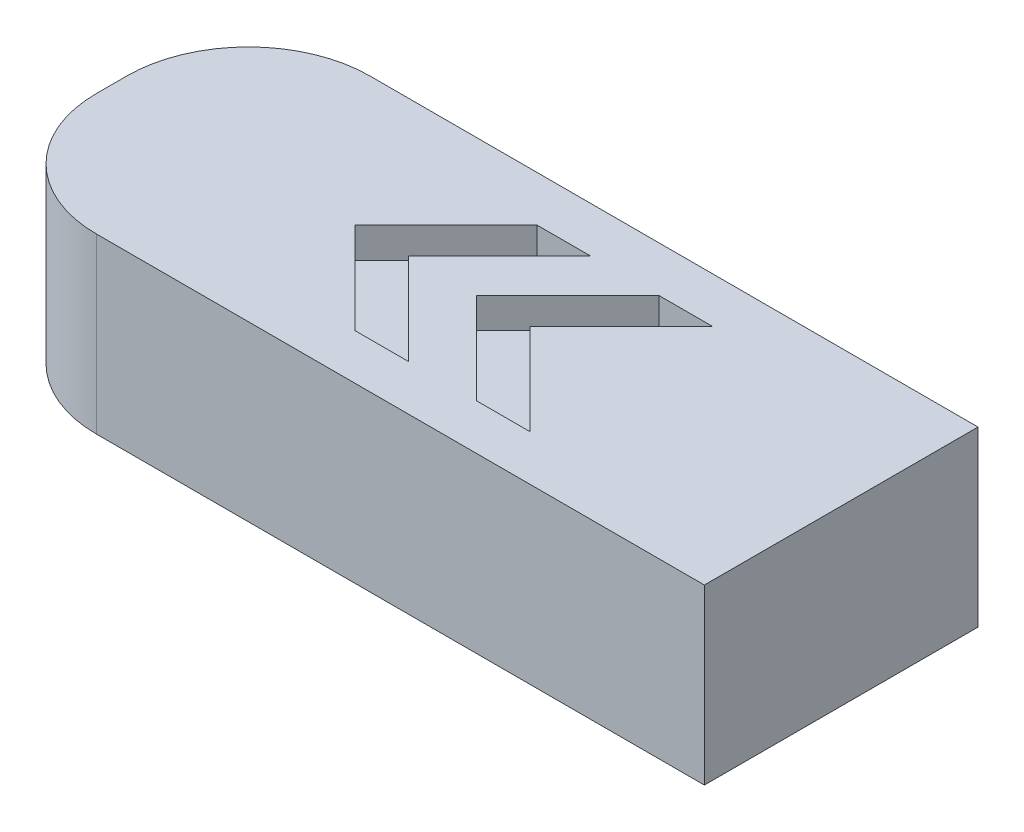
ISO-10303-21;
HEADER;
FILE_DESCRIPTION(('STEP AP214'),'2;1');
FILE_NAME('part.step','',(''),(''),'','','');
FILE_SCHEMA(('AUTOMOTIVE_DESIGN { 1 0 10303 214 1 1 1 1 }'));
ENDSEC;
DATA;
#1=APPLICATION_CONTEXT('core data for automotive mechanical design processes');
#2=APPLICATION_PROTOCOL_DEFINITION('international standard','automotive_design',2000,#1);
#3=PRODUCT_CONTEXT('',#1,'mechanical');
#4=PRODUCT('Part','Part','',(#3));
#5=PRODUCT_RELATED_PRODUCT_CATEGORY('part','',(#4));
#6=PRODUCT_DEFINITION_FORMATION('','',#4);
#7=PRODUCT_DEFINITION_CONTEXT('part definition',#1,'design');
#8=PRODUCT_DEFINITION('design','',#6,#7);
#9=PRODUCT_DEFINITION_SHAPE('','',#8);
#10=(LENGTH_UNIT() NAMED_UNIT(*) SI_UNIT(.MILLI.,.METRE.));
#11=(NAMED_UNIT(*) PLANE_ANGLE_UNIT() SI_UNIT($,.RADIAN.));
#12=(NAMED_UNIT(*) SI_UNIT($,.STERADIAN.) SOLID_ANGLE_UNIT());
#13=UNCERTAINTY_MEASURE_WITH_UNIT(LENGTH_MEASURE(1.E-05),#10,'distance_accuracy_value','');
#14=(GEOMETRIC_REPRESENTATION_CONTEXT(3) GLOBAL_UNCERTAINTY_ASSIGNED_CONTEXT((#13)) GLOBAL_UNIT_ASSIGNED_CONTEXT((#10,
#11,#12)) REPRESENTATION_CONTEXT('',''));
#15=CARTESIAN_POINT('',(0.,0.,0.));
#16=DIRECTION('',(0.,0.,1.));
#17=DIRECTION('',(1.,0.,0.));
#18=AXIS2_PLACEMENT_3D('',#15,#16,#17);
#19=CARTESIAN_POINT('',(0.,5.7,0.));
#20=DIRECTION('',(1.,0.,0.));
#21=DIRECTION('',(0.,0.,-1.));
#22=AXIS2_PLACEMENT_3D('',#19,#20,#21);
#23=PLANE('',#22);
#24=DIRECTION('',(0.,0.,1.));
#25=VECTOR('',#24,1.);
#26=CARTESIAN_POINT('',(0.,5.7,0.));
#27=LINE('',#26,#25);
#28=CARTESIAN_POINT('',(0.,5.7,-5.));
#29=VERTEX_POINT('',#28);
#30=CARTESIAN_POINT('',(0.,5.7,-4.));
#31=VERTEX_POINT('',#30);
#32=EDGE_CURVE('E257',#29,#31,#27,.T.);
#33=ORIENTED_EDGE('',*,*,#32,.F.);
#34=DIRECTION('',(0.,-1.,0.));
#35=VECTOR('',#34,1.);
#36=CARTESIAN_POINT('',(0.,5.7,-5.));
#37=LINE('',#36,#35);
#38=CARTESIAN_POINT('',(0.,0.,-5.));
#39=VERTEX_POINT('',#38);
#40=EDGE_CURVE('E291',#29,#39,#37,.T.);
#41=ORIENTED_EDGE('',*,*,#40,.T.);
#42=DIRECTION('',(0.,0.,1.));
#43=VECTOR('',#42,1.);
#44=CARTESIAN_POINT('',(0.,0.,0.));
#45=LINE('',#44,#43);
#46=CARTESIAN_POINT('',(0.,0.,-4.));
#47=VERTEX_POINT('',#46);
#48=EDGE_CURVE('E247',#39,#47,#45,.T.);
#49=ORIENTED_EDGE('',*,*,#48,.T.);
#50=DIRECTION('',(0.,-1.,0.));
#51=VECTOR('',#50,1.);
#52=CARTESIAN_POINT('',(0.,5.7,-4.));
#53=LINE('',#52,#51);
#54=EDGE_CURVE('E286',#47,#31,#53,.F.);
#55=ORIENTED_EDGE('',*,*,#54,.T.);
#56=EDGE_LOOP('',(#33,#41,#49,#55));
#57=FACE_BOUND('',#56,.T.);
#58=ADVANCED_FACE('F32',(#57),#23,.F.);
#59=CARTESIAN_POINT('',(0.,5.7,0.));
#60=DIRECTION('',(0.,0.,-1.));
#61=DIRECTION('',(-1.,0.,0.));
#62=AXIS2_PLACEMENT_3D('',#59,#60,#61);
#63=PLANE('',#62);
#64=DIRECTION('',(1.,0.,0.));
#65=VECTOR('',#64,1.);
#66=CARTESIAN_POINT('',(0.,5.7,0.));
#67=LINE('',#66,#65);
#68=CARTESIAN_POINT('',(4.,5.7,0.));
#69=VERTEX_POINT('',#68);
#70=CARTESIAN_POINT('',(24.,5.7,0.));
#71=VERTEX_POINT('',#70);
#72=EDGE_CURVE('E259',#69,#71,#67,.T.);
#73=ORIENTED_EDGE('',*,*,#72,.F.);
#74=DIRECTION('',(0.,-1.,0.));
#75=VECTOR('',#74,1.);
#76=CARTESIAN_POINT('',(4.,5.7,0.));
#77=LINE('',#76,#75);
#78=CARTESIAN_POINT('',(4.,0.,0.));
#79=VERTEX_POINT('',#78);
#80=EDGE_CURVE('E280',#69,#79,#77,.T.);
#81=ORIENTED_EDGE('',*,*,#80,.T.);
#82=DIRECTION('',(1.,0.,0.));
#83=VECTOR('',#82,1.);
#84=CARTESIAN_POINT('',(0.,0.,0.));
#85=LINE('',#84,#83);
#86=CARTESIAN_POINT('',(24.,0.,0.));
#87=VERTEX_POINT('',#86);
#88=EDGE_CURVE('E269',#79,#87,#85,.T.);
#89=ORIENTED_EDGE('',*,*,#88,.T.);
#90=DIRECTION('',(0.,-1.,0.));
#91=VECTOR('',#90,1.);
#92=CARTESIAN_POINT('',(24.,5.7,0.));
#93=LINE('',#92,#91);
#94=EDGE_CURVE('E277',#71,#87,#93,.T.);
#95=ORIENTED_EDGE('',*,*,#94,.F.);
#96=EDGE_LOOP('',(#73,#81,#89,#95));
#97=FACE_BOUND('',#96,.T.);
#98=ADVANCED_FACE('F322',(#97),#63,.F.);
#99=CARTESIAN_POINT('',(24.,5.7,0.));
#100=DIRECTION('',(-1.,0.,0.));
#101=DIRECTION('',(0.,0.,1.));
#102=AXIS2_PLACEMENT_3D('',#99,#100,#101);
#103=PLANE('',#102);
#104=DIRECTION('',(0.,0.,-1.));
#105=VECTOR('',#104,1.);
#106=CARTESIAN_POINT('',(24.,0.,0.));
#107=LINE('',#106,#105);
#108=CARTESIAN_POINT('',(24.,0.,-9.));
#109=VERTEX_POINT('',#108);
#110=EDGE_CURVE('E271',#87,#109,#107,.T.);
#111=ORIENTED_EDGE('',*,*,#110,.T.);
#112=DIRECTION('',(0.,-1.,0.));
#113=VECTOR('',#112,1.);
#114=CARTESIAN_POINT('',(24.,5.7,-9.));
#115=LINE('',#114,#113);
#116=CARTESIAN_POINT('',(24.,5.7,-9.));
#117=VERTEX_POINT('',#116);
#118=EDGE_CURVE('E267',#117,#109,#115,.T.);
#119=ORIENTED_EDGE('',*,*,#118,.F.);
#120=DIRECTION('',(0.,0.,-1.));
#121=VECTOR('',#120,1.);
#122=CARTESIAN_POINT('',(24.,5.7,0.));
#123=LINE('',#122,#121);
#124=EDGE_CURVE('E262',#71,#117,#123,.T.);
#125=ORIENTED_EDGE('',*,*,#124,.F.);
#126=ORIENTED_EDGE('',*,*,#94,.T.);
#127=EDGE_LOOP('',(#111,#119,#125,#126));
#128=FACE_BOUND('',#127,.T.);
#129=ADVANCED_FACE('F324',(#128),#103,.F.);
#130=CARTESIAN_POINT('',(0.,5.7,-9.));
#131=DIRECTION('',(0.,0.,1.));
#132=DIRECTION('',(1.,0.,0.));
#133=AXIS2_PLACEMENT_3D('',#130,#131,#132);
#134=PLANE('',#133);
#135=DIRECTION('',(-1.,0.,0.));
#136=VECTOR('',#135,1.);
#137=CARTESIAN_POINT('',(0.,0.,-9.));
#138=LINE('',#137,#136);
#139=CARTESIAN_POINT('',(4.,0.,-9.));
#140=VERTEX_POINT('',#139);
#141=EDGE_CURVE('E260',#109,#140,#138,.T.);
#142=ORIENTED_EDGE('',*,*,#141,.T.);
#143=DIRECTION('',(0.,-1.,0.));
#144=VECTOR('',#143,1.);
#145=CARTESIAN_POINT('',(4.,5.7,-9.));
#146=LINE('',#145,#144);
#147=CARTESIAN_POINT('',(4.,5.7,-9.));
#148=VERTEX_POINT('',#147);
#149=EDGE_CURVE('E40',#140,#148,#146,.F.);
#150=ORIENTED_EDGE('',*,*,#149,.T.);
#151=DIRECTION('',(-1.,0.,0.));
#152=VECTOR('',#151,1.);
#153=CARTESIAN_POINT('',(0.,5.7,-9.));
#154=LINE('',#153,#152);
#155=EDGE_CURVE('E264',#117,#148,#154,.T.);
#156=ORIENTED_EDGE('',*,*,#155,.F.);
#157=ORIENTED_EDGE('',*,*,#118,.T.);
#158=EDGE_LOOP('',(#142,#150,#156,#157));
#159=FACE_BOUND('',#158,.T.);
#160=ADVANCED_FACE('F298',(#159),#134,.F.);
#161=CARTESIAN_POINT('',(0.,5.7,0.));
#162=DIRECTION('',(0.,-1.,0.));
#163=DIRECTION('',(0.,0.,-1.));
#164=AXIS2_PLACEMENT_3D('',#161,#162,#163);
#165=PLANE('',#164);
#166=DIRECTION('',(0.707106781186548,0.,-0.707106781186547));
#167=VECTOR('',#166,1.);
#168=CARTESIAN_POINT('',(16.7677669529664,5.7,-7.5));
#169=LINE('',#168,#167);
#170=CARTESIAN_POINT('',(13.7677669529664,5.7,-4.5));
#171=VERTEX_POINT('',#170);
#172=CARTESIAN_POINT('',(16.7677669529664,5.7,-7.5));
#173=VERTEX_POINT('',#172);
#174=EDGE_CURVE('E191',#171,#173,#169,.T.);
#175=ORIENTED_EDGE('',*,*,#174,.F.);
#176=DIRECTION('',(-0.707106781186548,0.,-0.707106781186547));
#177=VECTOR('',#176,1.);
#178=CARTESIAN_POINT('',(13.7677669529664,5.7,-4.5));
#179=LINE('',#178,#177);
#180=CARTESIAN_POINT('',(16.7677669529664,5.7,-1.5));
#181=VERTEX_POINT('',#180);
#182=EDGE_CURVE('E47',#181,#171,#179,.T.);
#183=ORIENTED_EDGE('',*,*,#182,.F.);
#184=DIRECTION('',(1.,0.,0.));
#185=VECTOR('',#184,1.);
#186=CARTESIAN_POINT('',(16.7677669529664,5.7,-1.5));
#187=LINE('',#186,#185);
#188=CARTESIAN_POINT('',(15.,5.7,-1.5));
#189=VERTEX_POINT('',#188);
#190=EDGE_CURVE('E177',#189,#181,#187,.T.);
#191=ORIENTED_EDGE('',*,*,#190,.F.);
#192=DIRECTION('',(0.707106781186548,0.,0.707106781186547));
#193=VECTOR('',#192,1.);
#194=CARTESIAN_POINT('',(15.,5.7,-1.5));
#195=LINE('',#194,#193);
#196=CARTESIAN_POINT('',(12.,5.7,-4.5));
#197=VERTEX_POINT('',#196);
#198=EDGE_CURVE('E180',#197,#189,#195,.T.);
#199=ORIENTED_EDGE('',*,*,#198,.F.);
#200=DIRECTION('',(-0.707106781186547,0.,0.707106781186548));
#201=VECTOR('',#200,1.);
#202=CARTESIAN_POINT('',(12.,5.7,-4.5));
#203=LINE('',#202,#201);
#204=CARTESIAN_POINT('',(15.,5.7,-7.5));
#205=VERTEX_POINT('',#204);
#206=EDGE_CURVE('E196',#205,#197,#203,.T.);
#207=ORIENTED_EDGE('',*,*,#206,.F.);
#208=DIRECTION('',(-1.,0.,0.));
#209=VECTOR('',#208,1.);
#210=CARTESIAN_POINT('',(15.,5.7,-7.5));
#211=LINE('',#210,#209);
#212=EDGE_CURVE('E193',#173,#205,#211,.T.);
#213=ORIENTED_EDGE('',*,*,#212,.F.);
#214=EDGE_LOOP('',(#175,#183,#191,#199,#207,#213));
#215=FACE_BOUND('',#214,.T.);
#216=DIRECTION('',(0.707106781186548,0.,-0.707106781186547));
#217=VECTOR('',#216,1.);
#218=CARTESIAN_POINT('',(12.7677669529664,5.7,-7.5));
#219=LINE('',#218,#217);
#220=CARTESIAN_POINT('',(9.76776695296637,5.7,-4.5));
#221=VERTEX_POINT('',#220);
#222=CARTESIAN_POINT('',(12.7677669529664,5.7,-7.5));
#223=VERTEX_POINT('',#222);
#224=EDGE_CURVE('E231',#221,#223,#219,.T.);
#225=ORIENTED_EDGE('',*,*,#224,.F.);
#226=DIRECTION('',(-0.707106781186548,0.,-0.707106781186547));
#227=VECTOR('',#226,1.);
#228=CARTESIAN_POINT('',(9.76776695296637,5.7,-4.5));
#229=LINE('',#228,#227);
#230=CARTESIAN_POINT('',(12.7677669529664,5.7,-1.5));
#231=VERTEX_POINT('',#230);
#232=EDGE_CURVE('E55',#231,#221,#229,.T.);
#233=ORIENTED_EDGE('',*,*,#232,.F.);
#234=DIRECTION('',(1.,0.,0.));
#235=VECTOR('',#234,1.);
#236=CARTESIAN_POINT('',(12.7677669529664,5.7,-1.5));
#237=LINE('',#236,#235);
#238=CARTESIAN_POINT('',(11.,5.7,-1.5));
#239=VERTEX_POINT('',#238);
#240=EDGE_CURVE('E214',#239,#231,#237,.T.);
#241=ORIENTED_EDGE('',*,*,#240,.F.);
#242=DIRECTION('',(0.707106781186548,0.,0.707106781186547));
#243=VECTOR('',#242,1.);
#244=CARTESIAN_POINT('',(11.,5.7,-1.5));
#245=LINE('',#244,#243);
#246=CARTESIAN_POINT('',(8.,5.7,-4.5));
#247=VERTEX_POINT('',#246);
#248=EDGE_CURVE('E240',#247,#239,#245,.T.);
#249=ORIENTED_EDGE('',*,*,#248,.F.);
#250=DIRECTION('',(-0.707106781186547,0.,0.707106781186548));
#251=VECTOR('',#250,1.);
#252=CARTESIAN_POINT('',(8.,5.7,-4.5));
#253=LINE('',#252,#251);
#254=CARTESIAN_POINT('',(11.,5.7,-7.5));
#255=VERTEX_POINT('',#254);
#256=EDGE_CURVE('E237',#255,#247,#253,.T.);
#257=ORIENTED_EDGE('',*,*,#256,.F.);
#258=DIRECTION('',(-1.,0.,0.));
#259=VECTOR('',#258,1.);
#260=CARTESIAN_POINT('',(11.,5.7,-7.5));
#261=LINE('',#260,#259);
#262=EDGE_CURVE('E234',#223,#255,#261,.T.);
#263=ORIENTED_EDGE('',*,*,#262,.F.);
#264=EDGE_LOOP('',(#225,#233,#241,#249,#257,#263));
#265=FACE_BOUND('',#264,.T.);
#266=ORIENTED_EDGE('',*,*,#155,.T.);
#267=CARTESIAN_POINT('',(4.,5.7,-5.));
#268=DIRECTION('',(0.,-1.,0.));
#269=DIRECTION('',(0.,0.,-1.));
#270=AXIS2_PLACEMENT_3D('',#267,#268,#269);
#271=CIRCLE('',#270,4.);
#272=EDGE_CURVE('E11',#148,#29,#271,.F.);
#273=ORIENTED_EDGE('',*,*,#272,.T.);
#274=ORIENTED_EDGE('',*,*,#32,.T.);
#275=CARTESIAN_POINT('',(4.,5.7,-4.));
#276=DIRECTION('',(0.,-1.,0.));
#277=DIRECTION('',(0.,0.,-1.));
#278=AXIS2_PLACEMENT_3D('',#275,#276,#277);
#279=CIRCLE('',#278,4.);
#280=EDGE_CURVE('E289',#31,#69,#279,.F.);
#281=ORIENTED_EDGE('',*,*,#280,.T.);
#282=ORIENTED_EDGE('',*,*,#72,.T.);
#283=ORIENTED_EDGE('',*,*,#124,.T.);
#284=EDGE_LOOP('',(#266,#273,#274,#281,#282,#283));
#285=FACE_BOUND('',#284,.T.);
#286=ADVANCED_FACE('F303',(#215,#265,#285),#165,.F.);
#287=CARTESIAN_POINT('',(0.,0.,0.));
#288=DIRECTION('',(0.,-1.,0.));
#289=DIRECTION('',(0.,0.,-1.));
#290=AXIS2_PLACEMENT_3D('',#287,#288,#289);
#291=PLANE('',#290);
#292=ORIENTED_EDGE('',*,*,#48,.F.);
#293=CARTESIAN_POINT('',(4.,0.,-5.));
#294=DIRECTION('',(0.,-1.,0.));
#295=DIRECTION('',(0.,0.,-1.));
#296=AXIS2_PLACEMENT_3D('',#293,#294,#295);
#297=CIRCLE('',#296,4.);
#298=EDGE_CURVE('E294',#39,#140,#297,.T.);
#299=ORIENTED_EDGE('',*,*,#298,.T.);
#300=ORIENTED_EDGE('',*,*,#141,.F.);
#301=ORIENTED_EDGE('',*,*,#110,.F.);
#302=ORIENTED_EDGE('',*,*,#88,.F.);
#303=CARTESIAN_POINT('',(4.,0.,-4.));
#304=DIRECTION('',(0.,-1.,0.));
#305=DIRECTION('',(0.,0.,-1.));
#306=AXIS2_PLACEMENT_3D('',#303,#304,#305);
#307=CIRCLE('',#306,4.);
#308=EDGE_CURVE('E283',#79,#47,#307,.T.);
#309=ORIENTED_EDGE('',*,*,#308,.T.);
#310=EDGE_LOOP('',(#292,#299,#300,#301,#302,#309));
#311=FACE_BOUND('',#310,.T.);
#312=ADVANCED_FACE('F311',(#311),#291,.T.);
#313=CARTESIAN_POINT('',(4.,5.7,-4.));
#314=DIRECTION('',(0.,-1.,0.));
#315=DIRECTION('',(0.,0.,-1.));
#316=AXIS2_PLACEMENT_3D('',#313,#314,#315);
#317=CYLINDRICAL_SURFACE('',#316,4.);
#318=ORIENTED_EDGE('',*,*,#280,.F.);
#319=ORIENTED_EDGE('',*,*,#54,.F.);
#320=ORIENTED_EDGE('',*,*,#308,.F.);
#321=ORIENTED_EDGE('',*,*,#80,.F.);
#322=EDGE_LOOP('',(#318,#319,#320,#321));
#323=FACE_BOUND('',#322,.T.);
#324=ADVANCED_FACE('F318',(#323),#317,.T.);
#325=CARTESIAN_POINT('',(4.,5.7,-5.));
#326=DIRECTION('',(0.,-1.,0.));
#327=DIRECTION('',(0.,0.,-1.));
#328=AXIS2_PLACEMENT_3D('',#325,#326,#327);
#329=CYLINDRICAL_SURFACE('',#328,4.);
#330=ORIENTED_EDGE('',*,*,#272,.F.);
#331=ORIENTED_EDGE('',*,*,#149,.F.);
#332=ORIENTED_EDGE('',*,*,#298,.F.);
#333=ORIENTED_EDGE('',*,*,#40,.F.);
#334=EDGE_LOOP('',(#330,#331,#332,#333));
#335=FACE_BOUND('',#334,.T.);
#336=ADVANCED_FACE('F34',(#335),#329,.T.);
#337=CARTESIAN_POINT('',(9.76776695296637,4.7,-4.5));
#338=DIRECTION('',(0.707106781186547,0.,-0.707106781186548));
#339=DIRECTION('',(-0.707106781186548,0.,-0.707106781186547));
#340=AXIS2_PLACEMENT_3D('',#337,#338,#339);
#341=PLANE('',#340);
#342=ORIENTED_EDGE('',*,*,#232,.T.);
#343=DIRECTION('',(0.,1.,0.));
#344=VECTOR('',#343,1.);
#345=CARTESIAN_POINT('',(9.76776695296637,4.7,-4.5));
#346=LINE('',#345,#344);
#347=CARTESIAN_POINT('',(9.76776695296637,4.7,-4.5));
#348=VERTEX_POINT('',#347);
#349=EDGE_CURVE('E229',#348,#221,#346,.T.);
#350=ORIENTED_EDGE('',*,*,#349,.F.);
#351=DIRECTION('',(-0.707106781186548,0.,-0.707106781186547));
#352=VECTOR('',#351,1.);
#353=CARTESIAN_POINT('',(9.76776695296637,4.7,-4.5));
#354=LINE('',#353,#352);
#355=CARTESIAN_POINT('',(12.7677669529664,4.7,-1.5));
#356=VERTEX_POINT('',#355);
#357=EDGE_CURVE('E210',#356,#348,#354,.T.);
#358=ORIENTED_EDGE('',*,*,#357,.F.);
#359=DIRECTION('',(0.,1.,0.));
#360=VECTOR('',#359,1.);
#361=CARTESIAN_POINT('',(12.7677669529664,4.7,-1.5));
#362=LINE('',#361,#360);
#363=EDGE_CURVE('E245',#356,#231,#362,.T.);
#364=ORIENTED_EDGE('',*,*,#363,.T.);
#365=EDGE_LOOP('',(#342,#350,#358,#364));
#366=FACE_BOUND('',#365,.T.);
#367=ADVANCED_FACE('F342',(#366),#341,.F.);
#368=CARTESIAN_POINT('',(12.7677669529664,4.7,-1.5));
#369=DIRECTION('',(0.,0.,1.));
#370=DIRECTION('',(1.,0.,0.));
#371=AXIS2_PLACEMENT_3D('',#368,#369,#370);
#372=PLANE('',#371);
#373=ORIENTED_EDGE('',*,*,#240,.T.);
#374=ORIENTED_EDGE('',*,*,#363,.F.);
#375=DIRECTION('',(1.,0.,0.));
#376=VECTOR('',#375,1.);
#377=CARTESIAN_POINT('',(12.7677669529664,4.7,-1.5));
#378=LINE('',#377,#376);
#379=CARTESIAN_POINT('',(11.,4.7,-1.5));
#380=VERTEX_POINT('',#379);
#381=EDGE_CURVE('E226',#380,#356,#378,.T.);
#382=ORIENTED_EDGE('',*,*,#381,.F.);
#383=DIRECTION('',(0.,1.,0.));
#384=VECTOR('',#383,1.);
#385=CARTESIAN_POINT('',(11.,4.7,-1.5));
#386=LINE('',#385,#384);
#387=EDGE_CURVE('E248',#380,#239,#386,.T.);
#388=ORIENTED_EDGE('',*,*,#387,.T.);
#389=EDGE_LOOP('',(#373,#374,#382,#388));
#390=FACE_BOUND('',#389,.T.);
#391=ADVANCED_FACE('F352',(#390),#372,.F.);
#392=CARTESIAN_POINT('',(11.,4.7,-1.5));
#393=DIRECTION('',(-0.707106781186547,0.,0.707106781186548));
#394=DIRECTION('',(0.707106781186548,0.,0.707106781186547));
#395=AXIS2_PLACEMENT_3D('',#392,#393,#394);
#396=PLANE('',#395);
#397=ORIENTED_EDGE('',*,*,#248,.T.);
#398=ORIENTED_EDGE('',*,*,#387,.F.);
#399=DIRECTION('',(0.707106781186548,0.,0.707106781186547));
#400=VECTOR('',#399,1.);
#401=CARTESIAN_POINT('',(11.,4.7,-1.5));
#402=LINE('',#401,#400);
#403=CARTESIAN_POINT('',(8.,4.7,-4.5));
#404=VERTEX_POINT('',#403);
#405=EDGE_CURVE('E223',#404,#380,#402,.T.);
#406=ORIENTED_EDGE('',*,*,#405,.F.);
#407=DIRECTION('',(0.,1.,0.));
#408=VECTOR('',#407,1.);
#409=CARTESIAN_POINT('',(8.,4.7,-4.5));
#410=LINE('',#409,#408);
#411=EDGE_CURVE('E250',#404,#247,#410,.T.);
#412=ORIENTED_EDGE('',*,*,#411,.T.);
#413=EDGE_LOOP('',(#397,#398,#406,#412));
#414=FACE_BOUND('',#413,.T.);
#415=ADVANCED_FACE('F365',(#414),#396,.F.);
#416=CARTESIAN_POINT('',(8.,4.7,-4.5));
#417=DIRECTION('',(-0.707106781186548,0.,-0.707106781186547));
#418=DIRECTION('',(-0.707106781186547,0.,0.707106781186548));
#419=AXIS2_PLACEMENT_3D('',#416,#417,#418);
#420=PLANE('',#419);
#421=ORIENTED_EDGE('',*,*,#256,.T.);
#422=ORIENTED_EDGE('',*,*,#411,.F.);
#423=DIRECTION('',(-0.707106781186547,0.,0.707106781186548));
#424=VECTOR('',#423,1.);
#425=CARTESIAN_POINT('',(8.,4.7,-4.5));
#426=LINE('',#425,#424);
#427=CARTESIAN_POINT('',(11.,4.7,-7.5));
#428=VERTEX_POINT('',#427);
#429=EDGE_CURVE('E220',#428,#404,#426,.T.);
#430=ORIENTED_EDGE('',*,*,#429,.F.);
#431=DIRECTION('',(0.,1.,0.));
#432=VECTOR('',#431,1.);
#433=CARTESIAN_POINT('',(11.,4.7,-7.5));
#434=LINE('',#433,#432);
#435=EDGE_CURVE('E252',#428,#255,#434,.T.);
#436=ORIENTED_EDGE('',*,*,#435,.T.);
#437=EDGE_LOOP('',(#421,#422,#430,#436));
#438=FACE_BOUND('',#437,.T.);
#439=ADVANCED_FACE('F361',(#438),#420,.F.);
#440=CARTESIAN_POINT('',(11.,4.7,-7.5));
#441=DIRECTION('',(0.,0.,-1.));
#442=DIRECTION('',(-1.,0.,0.));
#443=AXIS2_PLACEMENT_3D('',#440,#441,#442);
#444=PLANE('',#443);
#445=ORIENTED_EDGE('',*,*,#262,.T.);
#446=ORIENTED_EDGE('',*,*,#435,.F.);
#447=DIRECTION('',(-1.,0.,0.));
#448=VECTOR('',#447,1.);
#449=CARTESIAN_POINT('',(11.,4.7,-7.5));
#450=LINE('',#449,#448);
#451=CARTESIAN_POINT('',(12.7677669529664,4.7,-7.5));
#452=VERTEX_POINT('',#451);
#453=EDGE_CURVE('E217',#452,#428,#450,.T.);
#454=ORIENTED_EDGE('',*,*,#453,.F.);
#455=DIRECTION('',(0.,1.,0.));
#456=VECTOR('',#455,1.);
#457=CARTESIAN_POINT('',(12.7677669529664,4.7,-7.5));
#458=LINE('',#457,#456);
#459=EDGE_CURVE('E254',#452,#223,#458,.T.);
#460=ORIENTED_EDGE('',*,*,#459,.T.);
#461=EDGE_LOOP('',(#445,#446,#454,#460));
#462=FACE_BOUND('',#461,.T.);
#463=ADVANCED_FACE('F357',(#462),#444,.F.);
#464=CARTESIAN_POINT('',(12.7677669529664,4.7,-7.5));
#465=DIRECTION('',(0.707106781186547,0.,0.707106781186548));
#466=DIRECTION('',(0.707106781186548,0.,-0.707106781186547));
#467=AXIS2_PLACEMENT_3D('',#464,#465,#466);
#468=PLANE('',#467);
#469=ORIENTED_EDGE('',*,*,#224,.T.);
#470=ORIENTED_EDGE('',*,*,#459,.F.);
#471=DIRECTION('',(0.707106781186548,0.,-0.707106781186547));
#472=VECTOR('',#471,1.);
#473=CARTESIAN_POINT('',(12.7677669529664,4.7,-7.5));
#474=LINE('',#473,#472);
#475=EDGE_CURVE('E213',#348,#452,#474,.T.);
#476=ORIENTED_EDGE('',*,*,#475,.F.);
#477=ORIENTED_EDGE('',*,*,#349,.T.);
#478=EDGE_LOOP('',(#469,#470,#476,#477));
#479=FACE_BOUND('',#478,.T.);
#480=ADVANCED_FACE('F353',(#479),#468,.F.);
#481=CARTESIAN_POINT('',(0.,4.7,0.));
#482=DIRECTION('',(0.,1.,0.));
#483=DIRECTION('',(0.,0.,1.));
#484=AXIS2_PLACEMENT_3D('',#481,#482,#483);
#485=PLANE('',#484);
#486=ORIENTED_EDGE('',*,*,#357,.T.);
#487=ORIENTED_EDGE('',*,*,#475,.T.);
#488=ORIENTED_EDGE('',*,*,#453,.T.);
#489=ORIENTED_EDGE('',*,*,#429,.T.);
#490=ORIENTED_EDGE('',*,*,#405,.T.);
#491=ORIENTED_EDGE('',*,*,#381,.T.);
#492=EDGE_LOOP('',(#486,#487,#488,#489,#490,#491));
#493=FACE_BOUND('',#492,.T.);
#494=ADVANCED_FACE('F356',(#493),#485,.T.);
#495=CARTESIAN_POINT('',(13.7677669529664,4.7,-4.5));
#496=DIRECTION('',(0.707106781186547,0.,-0.707106781186548));
#497=DIRECTION('',(-0.707106781186548,0.,-0.707106781186547));
#498=AXIS2_PLACEMENT_3D('',#495,#496,#497);
#499=PLANE('',#498);
#500=ORIENTED_EDGE('',*,*,#182,.T.);
#501=DIRECTION('',(0.,1.,0.));
#502=VECTOR('',#501,1.);
#503=CARTESIAN_POINT('',(13.7677669529664,4.7,-4.5));
#504=LINE('',#503,#502);
#505=CARTESIAN_POINT('',(13.7677669529664,4.7,-4.5));
#506=VERTEX_POINT('',#505);
#507=EDGE_CURVE('E154',#506,#171,#504,.T.);
#508=ORIENTED_EDGE('',*,*,#507,.F.);
#509=DIRECTION('',(-0.707106781186548,0.,-0.707106781186547));
#510=VECTOR('',#509,1.);
#511=CARTESIAN_POINT('',(13.7677669529664,4.7,-4.5));
#512=LINE('',#511,#510);
#513=CARTESIAN_POINT('',(16.7677669529664,4.7,-1.5));
#514=VERTEX_POINT('',#513);
#515=EDGE_CURVE('E158',#514,#506,#512,.T.);
#516=ORIENTED_EDGE('',*,*,#515,.F.);
#517=DIRECTION('',(0.,1.,0.));
#518=VECTOR('',#517,1.);
#519=CARTESIAN_POINT('',(16.7677669529664,4.7,-1.5));
#520=LINE('',#519,#518);
#521=EDGE_CURVE('E201',#514,#181,#520,.T.);
#522=ORIENTED_EDGE('',*,*,#521,.T.);
#523=EDGE_LOOP('',(#500,#508,#516,#522));
#524=FACE_BOUND('',#523,.T.);
#525=ADVANCED_FACE('F156',(#524),#499,.F.);
#526=CARTESIAN_POINT('',(16.7677669529664,4.7,-1.5));
#527=DIRECTION('',(0.,0.,1.));
#528=DIRECTION('',(1.,0.,0.));
#529=AXIS2_PLACEMENT_3D('',#526,#527,#528);
#530=PLANE('',#529);
#531=ORIENTED_EDGE('',*,*,#190,.T.);
#532=ORIENTED_EDGE('',*,*,#521,.F.);
#533=DIRECTION('',(1.,0.,0.));
#534=VECTOR('',#533,1.);
#535=CARTESIAN_POINT('',(16.7677669529664,4.7,-1.5));
#536=LINE('',#535,#534);
#537=CARTESIAN_POINT('',(15.,4.7,-1.5));
#538=VERTEX_POINT('',#537);
#539=EDGE_CURVE('E164',#538,#514,#536,.T.);
#540=ORIENTED_EDGE('',*,*,#539,.F.);
#541=DIRECTION('',(0.,1.,0.));
#542=VECTOR('',#541,1.);
#543=CARTESIAN_POINT('',(15.,4.7,-1.5));
#544=LINE('',#543,#542);
#545=EDGE_CURVE('E203',#538,#189,#544,.T.);
#546=ORIENTED_EDGE('',*,*,#545,.T.);
#547=EDGE_LOOP('',(#531,#532,#540,#546));
#548=FACE_BOUND('',#547,.T.);
#549=ADVANCED_FACE('F378',(#548),#530,.F.);
#550=CARTESIAN_POINT('',(15.,4.7,-1.5));
#551=DIRECTION('',(-0.707106781186547,0.,0.707106781186548));
#552=DIRECTION('',(0.707106781186548,0.,0.707106781186547));
#553=AXIS2_PLACEMENT_3D('',#550,#551,#552);
#554=PLANE('',#553);
#555=ORIENTED_EDGE('',*,*,#198,.T.);
#556=ORIENTED_EDGE('',*,*,#545,.F.);
#557=DIRECTION('',(0.707106781186548,0.,0.707106781186547));
#558=VECTOR('',#557,1.);
#559=CARTESIAN_POINT('',(15.,4.7,-1.5));
#560=LINE('',#559,#558);
#561=CARTESIAN_POINT('',(12.,4.7,-4.5));
#562=VERTEX_POINT('',#561);
#563=EDGE_CURVE('E187',#562,#538,#560,.T.);
#564=ORIENTED_EDGE('',*,*,#563,.F.);
#565=DIRECTION('',(0.,1.,0.));
#566=VECTOR('',#565,1.);
#567=CARTESIAN_POINT('',(12.,4.7,-4.5));
#568=LINE('',#567,#566);
#569=EDGE_CURVE('E205',#562,#197,#568,.T.);
#570=ORIENTED_EDGE('',*,*,#569,.T.);
#571=EDGE_LOOP('',(#555,#556,#564,#570));
#572=FACE_BOUND('',#571,.T.);
#573=ADVANCED_FACE('F388',(#572),#554,.F.);
#574=CARTESIAN_POINT('',(12.,4.7,-4.5));
#575=DIRECTION('',(-0.707106781186548,0.,-0.707106781186547));
#576=DIRECTION('',(-0.707106781186547,0.,0.707106781186548));
#577=AXIS2_PLACEMENT_3D('',#574,#575,#576);
#578=PLANE('',#577);
#579=ORIENTED_EDGE('',*,*,#206,.T.);
#580=ORIENTED_EDGE('',*,*,#569,.F.);
#581=DIRECTION('',(-0.707106781186547,0.,0.707106781186548));
#582=VECTOR('',#581,1.);
#583=CARTESIAN_POINT('',(12.,4.7,-4.5));
#584=LINE('',#583,#582);
#585=CARTESIAN_POINT('',(15.,4.7,-7.5));
#586=VERTEX_POINT('',#585);
#587=EDGE_CURVE('E184',#586,#562,#584,.T.);
#588=ORIENTED_EDGE('',*,*,#587,.F.);
#589=DIRECTION('',(0.,1.,0.));
#590=VECTOR('',#589,1.);
#591=CARTESIAN_POINT('',(15.,4.7,-7.5));
#592=LINE('',#591,#590);
#593=EDGE_CURVE('E207',#586,#205,#592,.T.);
#594=ORIENTED_EDGE('',*,*,#593,.T.);
#595=EDGE_LOOP('',(#579,#580,#588,#594));
#596=FACE_BOUND('',#595,.T.);
#597=ADVANCED_FACE('F384',(#596),#578,.F.);
#598=CARTESIAN_POINT('',(15.,4.7,-7.5));
#599=DIRECTION('',(0.,0.,-1.));
#600=DIRECTION('',(-1.,0.,0.));
#601=AXIS2_PLACEMENT_3D('',#598,#599,#600);
#602=PLANE('',#601);
#603=ORIENTED_EDGE('',*,*,#212,.T.);
#604=ORIENTED_EDGE('',*,*,#593,.F.);
#605=DIRECTION('',(-1.,0.,0.));
#606=VECTOR('',#605,1.);
#607=CARTESIAN_POINT('',(15.,4.7,-7.5));
#608=LINE('',#607,#606);
#609=CARTESIAN_POINT('',(16.7677669529664,4.7,-7.5));
#610=VERTEX_POINT('',#609);
#611=EDGE_CURVE('E172',#610,#586,#608,.T.);
#612=ORIENTED_EDGE('',*,*,#611,.F.);
#613=DIRECTION('',(0.,1.,0.));
#614=VECTOR('',#613,1.);
#615=CARTESIAN_POINT('',(16.7677669529664,4.7,-7.5));
#616=LINE('',#615,#614);
#617=EDGE_CURVE('E163',#610,#173,#616,.T.);
#618=ORIENTED_EDGE('',*,*,#617,.T.);
#619=EDGE_LOOP('',(#603,#604,#612,#618));
#620=FACE_BOUND('',#619,.T.);
#621=ADVANCED_FACE('F381',(#620),#602,.F.);
#622=CARTESIAN_POINT('',(16.7677669529664,4.7,-7.5));
#623=DIRECTION('',(0.707106781186547,0.,0.707106781186548));
#624=DIRECTION('',(0.707106781186548,0.,-0.707106781186547));
#625=AXIS2_PLACEMENT_3D('',#622,#623,#624);
#626=PLANE('',#625);
#627=ORIENTED_EDGE('',*,*,#174,.T.);
#628=ORIENTED_EDGE('',*,*,#617,.F.);
#629=DIRECTION('',(0.707106781186548,0.,-0.707106781186547));
#630=VECTOR('',#629,1.);
#631=CARTESIAN_POINT('',(16.7677669529664,4.7,-7.5));
#632=LINE('',#631,#630);
#633=EDGE_CURVE('E167',#506,#610,#632,.T.);
#634=ORIENTED_EDGE('',*,*,#633,.F.);
#635=ORIENTED_EDGE('',*,*,#507,.T.);
#636=EDGE_LOOP('',(#627,#628,#634,#635));
#637=FACE_BOUND('',#636,.T.);
#638=ADVANCED_FACE('F168',(#637),#626,.F.);
#639=CARTESIAN_POINT('',(4.,4.7,0.));
#640=DIRECTION('',(0.,1.,0.));
#641=DIRECTION('',(0.,0.,1.));
#642=AXIS2_PLACEMENT_3D('',#639,#640,#641);
#643=PLANE('',#642);
#644=ORIENTED_EDGE('',*,*,#515,.T.);
#645=ORIENTED_EDGE('',*,*,#633,.T.);
#646=ORIENTED_EDGE('',*,*,#611,.T.);
#647=ORIENTED_EDGE('',*,*,#587,.T.);
#648=ORIENTED_EDGE('',*,*,#563,.T.);
#649=ORIENTED_EDGE('',*,*,#539,.T.);
#650=EDGE_LOOP('',(#644,#645,#646,#647,#648,#649));
#651=FACE_BOUND('',#650,.T.);
#652=ADVANCED_FACE('F174',(#651),#643,.T.);
#653=CLOSED_SHELL('',(#58,#98,#129,#160,#286,#312,#324,#336,#367,#391,#415,#439,#463,#480,#494,
#525,#549,#573,#597,#621,#638,#652));
#654=MANIFOLD_SOLID_BREP('B2',#653);
#655=ADVANCED_BREP_SHAPE_REPRESENTATION('',(#18,#654),#14);
#656=SHAPE_DEFINITION_REPRESENTATION(#9,#655);
ENDSEC;
END-ISO-10303-21;
